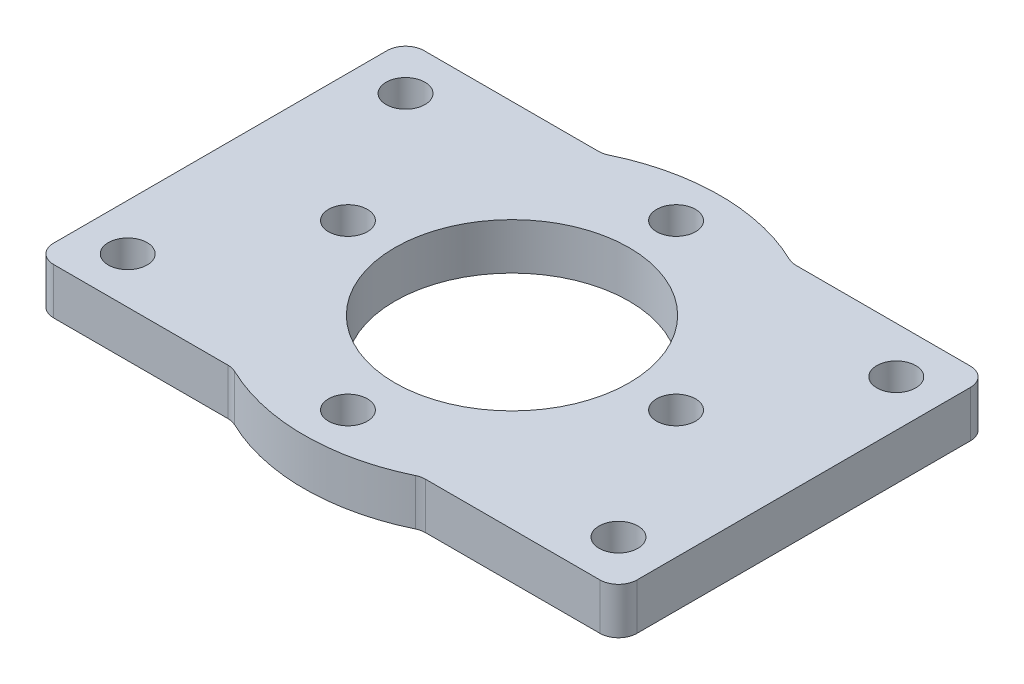
ISO-10303-21;
HEADER;
FILE_DESCRIPTION(('STEP AP214'),'2;1');
FILE_NAME('part.step','',(''),(''),'','','');
FILE_SCHEMA(('AUTOMOTIVE_DESIGN { 1 0 10303 214 1 1 1 1 }'));
ENDSEC;
DATA;
#1=APPLICATION_CONTEXT('core data for automotive mechanical design processes');
#2=APPLICATION_PROTOCOL_DEFINITION('international standard','automotive_design',2000,#1);
#3=PRODUCT_CONTEXT('',#1,'mechanical');
#4=PRODUCT('Part','Part','',(#3));
#5=PRODUCT_RELATED_PRODUCT_CATEGORY('part','',(#4));
#6=PRODUCT_DEFINITION_FORMATION('','',#4);
#7=PRODUCT_DEFINITION_CONTEXT('part definition',#1,'design');
#8=PRODUCT_DEFINITION('design','',#6,#7);
#9=PRODUCT_DEFINITION_SHAPE('','',#8);
#10=(LENGTH_UNIT() NAMED_UNIT(*) SI_UNIT(.MILLI.,.METRE.));
#11=(NAMED_UNIT(*) PLANE_ANGLE_UNIT() SI_UNIT($,.RADIAN.));
#12=(NAMED_UNIT(*) SI_UNIT($,.STERADIAN.) SOLID_ANGLE_UNIT());
#13=UNCERTAINTY_MEASURE_WITH_UNIT(LENGTH_MEASURE(1.E-05),#10,'distance_accuracy_value','');
#14=(GEOMETRIC_REPRESENTATION_CONTEXT(3) GLOBAL_UNCERTAINTY_ASSIGNED_CONTEXT((#13)) GLOBAL_UNIT_ASSIGNED_CONTEXT((#10,
#11,#12)) REPRESENTATION_CONTEXT('',''));
#15=CARTESIAN_POINT('',(0.,0.,0.));
#16=DIRECTION('',(0.,0.,1.));
#17=DIRECTION('',(1.,0.,0.));
#18=AXIS2_PLACEMENT_3D('',#15,#16,#17);
#19=CARTESIAN_POINT('',(0.,6.35,0.));
#20=DIRECTION('',(0.,-1.,0.));
#21=DIRECTION('',(0.,0.,-1.));
#22=AXIS2_PLACEMENT_3D('',#19,#20,#21);
#23=CYLINDRICAL_SURFACE('',#22,28.5);
#24=CARTESIAN_POINT('',(0.,0.,0.));
#25=DIRECTION('',(0.,1.,0.));
#26=DIRECTION('',(0.,0.,1.));
#27=AXIS2_PLACEMENT_3D('',#24,#25,#26);
#28=CIRCLE('',#27,28.5);
#29=CARTESIAN_POINT('',(12.4152759939626,0.,-25.6536726804124));
#30=VERTEX_POINT('',#29);
#31=CARTESIAN_POINT('',(-12.4152759939626,0.,-25.6536726804124));
#32=VERTEX_POINT('',#31);
#33=EDGE_CURVE('E211',#30,#32,#28,.T.);
#34=ORIENTED_EDGE('',*,*,#33,.T.);
#35=DIRECTION('',(0.,-1.,0.));
#36=VECTOR('',#35,1.);
#37=CARTESIAN_POINT('',(-12.4152759939626,6.35,-25.6536726804124));
#38=LINE('',#37,#36);
#39=CARTESIAN_POINT('',(-12.4152759939626,6.35,-25.6536726804124));
#40=VERTEX_POINT('',#39);
#41=EDGE_CURVE('E256',#32,#40,#38,.F.);
#42=ORIENTED_EDGE('',*,*,#41,.T.);
#43=CARTESIAN_POINT('',(0.,6.35,0.));
#44=DIRECTION('',(0.,1.,0.));
#45=DIRECTION('',(0.,0.,1.));
#46=AXIS2_PLACEMENT_3D('',#43,#44,#45);
#47=CIRCLE('',#46,28.5);
#48=CARTESIAN_POINT('',(12.4152759939626,6.35,-25.6536726804124));
#49=VERTEX_POINT('',#48);
#50=EDGE_CURVE('E229',#49,#40,#47,.T.);
#51=ORIENTED_EDGE('',*,*,#50,.F.);
#52=DIRECTION('',(0.,-1.,0.));
#53=VECTOR('',#52,1.);
#54=CARTESIAN_POINT('',(12.4152759939626,6.35,-25.6536726804124));
#55=LINE('',#54,#53);
#56=EDGE_CURVE('E252',#49,#30,#55,.T.);
#57=ORIENTED_EDGE('',*,*,#56,.T.);
#58=EDGE_LOOP('',(#34,#42,#51,#57));
#59=FACE_BOUND('',#58,.T.);
#60=ADVANCED_FACE('F39',(#59),#23,.T.);
#61=CARTESIAN_POINT('',(-12.9263297188336,6.35,-25.4));
#62=DIRECTION('',(0.,0.,1.));
#63=DIRECTION('',(1.,0.,0.));
#64=AXIS2_PLACEMENT_3D('',#61,#62,#63);
#65=PLANE('',#64);
#66=DIRECTION('',(-1.,0.,0.));
#67=VECTOR('',#66,1.);
#68=CARTESIAN_POINT('',(-12.9263297188336,0.,-25.4));
#69=LINE('',#68,#67);
#70=CARTESIAN_POINT('',(-13.5217602404421,0.,-25.4));
#71=VERTEX_POINT('',#70);
#72=CARTESIAN_POINT('',(-37.46,0.,-25.4));
#73=VERTEX_POINT('',#72);
#74=EDGE_CURVE('E204',#71,#73,#69,.T.);
#75=ORIENTED_EDGE('',*,*,#74,.T.);
#76=DIRECTION('',(0.,-1.,0.));
#77=VECTOR('',#76,1.);
#78=CARTESIAN_POINT('',(-37.46,6.35,-25.4));
#79=LINE('',#78,#77);
#80=CARTESIAN_POINT('',(-37.46,6.35,-25.4));
#81=VERTEX_POINT('',#80);
#82=EDGE_CURVE('E179',#73,#81,#79,.F.);
#83=ORIENTED_EDGE('',*,*,#82,.T.);
#84=DIRECTION('',(-1.,0.,0.));
#85=VECTOR('',#84,1.);
#86=CARTESIAN_POINT('',(-12.9263297188336,6.35,-25.4));
#87=LINE('',#86,#85);
#88=CARTESIAN_POINT('',(-13.5217602404421,6.35,-25.4));
#89=VERTEX_POINT('',#88);
#90=EDGE_CURVE('E361',#89,#81,#87,.T.);
#91=ORIENTED_EDGE('',*,*,#90,.F.);
#92=DIRECTION('',(0.,1.,0.));
#93=VECTOR('',#92,1.);
#94=CARTESIAN_POINT('',(-13.5217602404421,0.,-25.4));
#95=LINE('',#94,#93);
#96=EDGE_CURVE('E185',#89,#71,#95,.F.);
#97=ORIENTED_EDGE('',*,*,#96,.T.);
#98=EDGE_LOOP('',(#75,#83,#91,#97));
#99=FACE_BOUND('',#98,.T.);
#100=ADVANCED_FACE('F372',(#99),#65,.F.);
#101=CARTESIAN_POINT('',(-40.,6.35,-25.4));
#102=DIRECTION('',(1.,0.,0.));
#103=DIRECTION('',(0.,0.,-1.));
#104=AXIS2_PLACEMENT_3D('',#101,#102,#103);
#105=PLANE('',#104);
#106=DIRECTION('',(0.,0.,1.));
#107=VECTOR('',#106,1.);
#108=CARTESIAN_POINT('',(-40.,6.35,-25.4));
#109=LINE('',#108,#107);
#110=CARTESIAN_POINT('',(-40.,6.35,-22.86));
#111=VERTEX_POINT('',#110);
#112=CARTESIAN_POINT('',(-40.,6.35,22.86));
#113=VERTEX_POINT('',#112);
#114=EDGE_CURVE('E195',#111,#113,#109,.T.);
#115=ORIENTED_EDGE('',*,*,#114,.F.);
#116=DIRECTION('',(0.,-1.,0.));
#117=VECTOR('',#116,1.);
#118=CARTESIAN_POINT('',(-40.,6.35,-22.86));
#119=LINE('',#118,#117);
#120=CARTESIAN_POINT('',(-40.,0.,-22.86));
#121=VERTEX_POINT('',#120);
#122=EDGE_CURVE('E178',#111,#121,#119,.T.);
#123=ORIENTED_EDGE('',*,*,#122,.T.);
#124=DIRECTION('',(0.,0.,1.));
#125=VECTOR('',#124,1.);
#126=CARTESIAN_POINT('',(-40.,0.,-25.4));
#127=LINE('',#126,#125);
#128=CARTESIAN_POINT('',(-40.,0.,22.86));
#129=VERTEX_POINT('',#128);
#130=EDGE_CURVE('E192',#121,#129,#127,.T.);
#131=ORIENTED_EDGE('',*,*,#130,.T.);
#132=DIRECTION('',(0.,-1.,0.));
#133=VECTOR('',#132,1.);
#134=CARTESIAN_POINT('',(-40.,6.35,22.86));
#135=LINE('',#134,#133);
#136=EDGE_CURVE('E198',#129,#113,#135,.F.);
#137=ORIENTED_EDGE('',*,*,#136,.T.);
#138=EDGE_LOOP('',(#115,#123,#131,#137));
#139=FACE_BOUND('',#138,.T.);
#140=ADVANCED_FACE('F191',(#139),#105,.F.);
#141=CARTESIAN_POINT('',(-12.9263297188336,6.35,25.4));
#142=DIRECTION('',(0.,0.,-1.));
#143=DIRECTION('',(-1.,0.,0.));
#144=AXIS2_PLACEMENT_3D('',#141,#142,#143);
#145=PLANE('',#144);
#146=DIRECTION('',(1.,0.,0.));
#147=VECTOR('',#146,1.);
#148=CARTESIAN_POINT('',(-12.9263297188336,0.,25.4));
#149=LINE('',#148,#147);
#150=CARTESIAN_POINT('',(-37.46,0.,25.4));
#151=VERTEX_POINT('',#150);
#152=CARTESIAN_POINT('',(-13.5217602404421,0.,25.4));
#153=VERTEX_POINT('',#152);
#154=EDGE_CURVE('E203',#151,#153,#149,.T.);
#155=ORIENTED_EDGE('',*,*,#154,.T.);
#156=DIRECTION('',(0.,1.,0.));
#157=VECTOR('',#156,1.);
#158=CARTESIAN_POINT('',(-13.5217602404421,6.35,25.4));
#159=LINE('',#158,#157);
#160=CARTESIAN_POINT('',(-13.5217602404421,6.35,25.4));
#161=VERTEX_POINT('',#160);
#162=EDGE_CURVE('E287',#153,#161,#159,.T.);
#163=ORIENTED_EDGE('',*,*,#162,.T.);
#164=DIRECTION('',(1.,0.,0.));
#165=VECTOR('',#164,1.);
#166=CARTESIAN_POINT('',(-12.9263297188336,6.35,25.4));
#167=LINE('',#166,#165);
#168=CARTESIAN_POINT('',(-37.46,6.35,25.4));
#169=VERTEX_POINT('',#168);
#170=EDGE_CURVE('E323',#169,#161,#167,.T.);
#171=ORIENTED_EDGE('',*,*,#170,.F.);
#172=DIRECTION('',(0.,-1.,0.));
#173=VECTOR('',#172,1.);
#174=CARTESIAN_POINT('',(-37.46,6.35,25.4));
#175=LINE('',#174,#173);
#176=EDGE_CURVE('E283',#169,#151,#175,.T.);
#177=ORIENTED_EDGE('',*,*,#176,.T.);
#178=EDGE_LOOP('',(#155,#163,#171,#177));
#179=FACE_BOUND('',#178,.T.);
#180=ADVANCED_FACE('F311',(#179),#145,.F.);
#181=CARTESIAN_POINT('',(0.,6.35,0.));
#182=DIRECTION('',(0.,-1.,0.));
#183=DIRECTION('',(0.,0.,-1.));
#184=AXIS2_PLACEMENT_3D('',#181,#182,#183);
#185=CYLINDRICAL_SURFACE('',#184,28.5);
#186=CARTESIAN_POINT('',(0.,0.,0.));
#187=DIRECTION('',(0.,1.,0.));
#188=DIRECTION('',(0.,0.,1.));
#189=AXIS2_PLACEMENT_3D('',#186,#187,#188);
#190=CIRCLE('',#189,28.5);
#191=CARTESIAN_POINT('',(-12.4152759939626,0.,25.6536726804124));
#192=VERTEX_POINT('',#191);
#193=CARTESIAN_POINT('',(12.4152759939626,0.,25.6536726804124));
#194=VERTEX_POINT('',#193);
#195=EDGE_CURVE('E208',#192,#194,#190,.T.);
#196=ORIENTED_EDGE('',*,*,#195,.T.);
#197=DIRECTION('',(0.,-1.,0.));
#198=VECTOR('',#197,1.);
#199=CARTESIAN_POINT('',(12.4152759939626,6.35,25.6536726804124));
#200=LINE('',#199,#198);
#201=CARTESIAN_POINT('',(12.4152759939626,6.35,25.6536726804124));
#202=VERTEX_POINT('',#201);
#203=EDGE_CURVE('E280',#194,#202,#200,.F.);
#204=ORIENTED_EDGE('',*,*,#203,.T.);
#205=CARTESIAN_POINT('',(0.,6.35,0.));
#206=DIRECTION('',(0.,1.,0.));
#207=DIRECTION('',(0.,0.,1.));
#208=AXIS2_PLACEMENT_3D('',#205,#206,#207);
#209=CIRCLE('',#208,28.5);
#210=CARTESIAN_POINT('',(-12.4152759939626,6.35,25.6536726804124));
#211=VERTEX_POINT('',#210);
#212=EDGE_CURVE('E321',#211,#202,#209,.T.);
#213=ORIENTED_EDGE('',*,*,#212,.F.);
#214=DIRECTION('',(0.,-1.,0.));
#215=VECTOR('',#214,1.);
#216=CARTESIAN_POINT('',(-12.4152759939626,6.35,25.6536726804124));
#217=LINE('',#216,#215);
#218=EDGE_CURVE('E276',#211,#192,#217,.T.);
#219=ORIENTED_EDGE('',*,*,#218,.T.);
#220=EDGE_LOOP('',(#196,#204,#213,#219));
#221=FACE_BOUND('',#220,.T.);
#222=ADVANCED_FACE('F325',(#221),#185,.T.);
#223=CARTESIAN_POINT('',(40.,6.35,25.4));
#224=DIRECTION('',(0.,0.,-1.));
#225=DIRECTION('',(-1.,0.,0.));
#226=AXIS2_PLACEMENT_3D('',#223,#224,#225);
#227=PLANE('',#226);
#228=DIRECTION('',(1.,0.,0.));
#229=VECTOR('',#228,1.);
#230=CARTESIAN_POINT('',(40.,0.,25.4));
#231=LINE('',#230,#229);
#232=CARTESIAN_POINT('',(13.5217602404421,0.,25.4));
#233=VERTEX_POINT('',#232);
#234=CARTESIAN_POINT('',(37.46,0.,25.4));
#235=VERTEX_POINT('',#234);
#236=EDGE_CURVE('E218',#233,#235,#231,.T.);
#237=ORIENTED_EDGE('',*,*,#236,.T.);
#238=DIRECTION('',(0.,-1.,0.));
#239=VECTOR('',#238,1.);
#240=CARTESIAN_POINT('',(37.46,6.35,25.4));
#241=LINE('',#240,#239);
#242=CARTESIAN_POINT('',(37.46,6.35,25.4));
#243=VERTEX_POINT('',#242);
#244=EDGE_CURVE('E273',#235,#243,#241,.F.);
#245=ORIENTED_EDGE('',*,*,#244,.T.);
#246=DIRECTION('',(1.,0.,0.));
#247=VECTOR('',#246,1.);
#248=CARTESIAN_POINT('',(40.,6.35,25.4));
#249=LINE('',#248,#247);
#250=CARTESIAN_POINT('',(13.5217602404421,6.35,25.4));
#251=VERTEX_POINT('',#250);
#252=EDGE_CURVE('E328',#251,#243,#249,.T.);
#253=ORIENTED_EDGE('',*,*,#252,.F.);
#254=DIRECTION('',(0.,1.,0.));
#255=VECTOR('',#254,1.);
#256=CARTESIAN_POINT('',(13.5217602404421,0.,25.4));
#257=LINE('',#256,#255);
#258=EDGE_CURVE('E269',#251,#233,#257,.F.);
#259=ORIENTED_EDGE('',*,*,#258,.T.);
#260=EDGE_LOOP('',(#237,#245,#253,#259));
#261=FACE_BOUND('',#260,.T.);
#262=ADVANCED_FACE('F408',(#261),#227,.F.);
#263=CARTESIAN_POINT('',(40.,6.35,-25.4));
#264=DIRECTION('',(-1.,0.,0.));
#265=DIRECTION('',(0.,0.,1.));
#266=AXIS2_PLACEMENT_3D('',#263,#264,#265);
#267=PLANE('',#266);
#268=DIRECTION('',(0.,0.,-1.));
#269=VECTOR('',#268,1.);
#270=CARTESIAN_POINT('',(40.,0.,-25.4));
#271=LINE('',#270,#269);
#272=CARTESIAN_POINT('',(40.,0.,22.86));
#273=VERTEX_POINT('',#272);
#274=CARTESIAN_POINT('',(40.,0.,-22.86));
#275=VERTEX_POINT('',#274);
#276=EDGE_CURVE('E222',#273,#275,#271,.T.);
#277=ORIENTED_EDGE('',*,*,#276,.T.);
#278=DIRECTION('',(0.,-1.,0.));
#279=VECTOR('',#278,1.);
#280=CARTESIAN_POINT('',(40.,6.35,-22.86));
#281=LINE('',#280,#279);
#282=CARTESIAN_POINT('',(40.,6.35,-22.86));
#283=VERTEX_POINT('',#282);
#284=EDGE_CURVE('E267',#275,#283,#281,.F.);
#285=ORIENTED_EDGE('',*,*,#284,.T.);
#286=DIRECTION('',(0.,0.,-1.));
#287=VECTOR('',#286,1.);
#288=CARTESIAN_POINT('',(40.,6.35,-25.4));
#289=LINE('',#288,#287);
#290=CARTESIAN_POINT('',(40.,6.35,22.86));
#291=VERTEX_POINT('',#290);
#292=EDGE_CURVE('E333',#291,#283,#289,.T.);
#293=ORIENTED_EDGE('',*,*,#292,.F.);
#294=DIRECTION('',(0.,-1.,0.));
#295=VECTOR('',#294,1.);
#296=CARTESIAN_POINT('',(40.,6.35,22.86));
#297=LINE('',#296,#295);
#298=EDGE_CURVE('E263',#291,#273,#297,.T.);
#299=ORIENTED_EDGE('',*,*,#298,.T.);
#300=EDGE_LOOP('',(#277,#285,#293,#299));
#301=FACE_BOUND('',#300,.T.);
#302=ADVANCED_FACE('F414',(#301),#267,.F.);
#303=CARTESIAN_POINT('',(40.,6.35,-25.4));
#304=DIRECTION('',(0.,0.,1.));
#305=DIRECTION('',(1.,0.,0.));
#306=AXIS2_PLACEMENT_3D('',#303,#304,#305);
#307=PLANE('',#306);
#308=DIRECTION('',(-1.,0.,0.));
#309=VECTOR('',#308,1.);
#310=CARTESIAN_POINT('',(40.,0.,-25.4));
#311=LINE('',#310,#309);
#312=CARTESIAN_POINT('',(37.46,0.,-25.4));
#313=VERTEX_POINT('',#312);
#314=CARTESIAN_POINT('',(13.5217602404421,0.,-25.4));
#315=VERTEX_POINT('',#314);
#316=EDGE_CURVE('E226',#313,#315,#311,.T.);
#317=ORIENTED_EDGE('',*,*,#316,.T.);
#318=DIRECTION('',(0.,1.,0.));
#319=VECTOR('',#318,1.);
#320=CARTESIAN_POINT('',(13.5217602404421,6.35,-25.4));
#321=LINE('',#320,#319);
#322=CARTESIAN_POINT('',(13.5217602404421,6.35,-25.4));
#323=VERTEX_POINT('',#322);
#324=EDGE_CURVE('E55',#315,#323,#321,.T.);
#325=ORIENTED_EDGE('',*,*,#324,.T.);
#326=DIRECTION('',(-1.,0.,0.));
#327=VECTOR('',#326,1.);
#328=CARTESIAN_POINT('',(40.,6.35,-25.4));
#329=LINE('',#328,#327);
#330=CARTESIAN_POINT('',(37.46,6.35,-25.4));
#331=VERTEX_POINT('',#330);
#332=EDGE_CURVE('E231',#331,#323,#329,.T.);
#333=ORIENTED_EDGE('',*,*,#332,.F.);
#334=DIRECTION('',(0.,-1.,0.));
#335=VECTOR('',#334,1.);
#336=CARTESIAN_POINT('',(37.46,6.35,-25.4));
#337=LINE('',#336,#335);
#338=EDGE_CURVE('E258',#331,#313,#337,.T.);
#339=ORIENTED_EDGE('',*,*,#338,.T.);
#340=EDGE_LOOP('',(#317,#325,#333,#339));
#341=FACE_BOUND('',#340,.T.);
#342=ADVANCED_FACE('F419',(#341),#307,.F.);
#343=CARTESIAN_POINT('',(0.,6.35,0.));
#344=DIRECTION('',(0.,1.,0.));
#345=DIRECTION('',(0.,0.,1.));
#346=AXIS2_PLACEMENT_3D('',#343,#344,#345);
#347=PLANE('',#346);
#348=CARTESIAN_POINT('',(-33.65,6.35,19.05));
#349=DIRECTION('',(0.,1.,0.));
#350=DIRECTION('',(0.,0.,1.));
#351=AXIS2_PLACEMENT_3D('',#348,#349,#350);
#352=CIRCLE('',#351,2.665);
#353=CARTESIAN_POINT('',(-33.65,6.35,21.715));
#354=VERTEX_POINT('',#353);
#355=EDGE_CURVE('E642',#354,#354,#352,.T.);
#356=ORIENTED_EDGE('',*,*,#355,.F.);
#357=EDGE_LOOP('',(#356));
#358=FACE_BOUND('',#357,.T.);
#359=CARTESIAN_POINT('',(33.65,6.35,-19.05));
#360=DIRECTION('',(0.,1.,0.));
#361=DIRECTION('',(0.,0.,-1.));
#362=AXIS2_PLACEMENT_3D('',#359,#360,#361);
#363=CIRCLE('',#362,2.665);
#364=CARTESIAN_POINT('',(33.65,6.35,-21.715));
#365=VERTEX_POINT('',#364);
#366=EDGE_CURVE('E655',#365,#365,#363,.T.);
#367=ORIENTED_EDGE('',*,*,#366,.F.);
#368=EDGE_LOOP('',(#367));
#369=FACE_BOUND('',#368,.T.);
#370=CARTESIAN_POINT('',(33.65,6.35,19.05));
#371=DIRECTION('',(0.,1.,0.));
#372=DIRECTION('',(0.,0.,-1.));
#373=AXIS2_PLACEMENT_3D('',#370,#371,#372);
#374=CIRCLE('',#373,2.665);
#375=CARTESIAN_POINT('',(33.65,6.35,16.385));
#376=VERTEX_POINT('',#375);
#377=EDGE_CURVE('E661',#376,#376,#374,.T.);
#378=ORIENTED_EDGE('',*,*,#377,.F.);
#379=EDGE_LOOP('',(#378));
#380=FACE_BOUND('',#379,.T.);
#381=CARTESIAN_POINT('',(-33.65,6.35,-19.05));
#382=DIRECTION('',(0.,1.,0.));
#383=DIRECTION('',(0.,0.,1.));
#384=AXIS2_PLACEMENT_3D('',#381,#382,#383);
#385=CIRCLE('',#384,2.665);
#386=CARTESIAN_POINT('',(-33.65,6.35,-16.385));
#387=VERTEX_POINT('',#386);
#388=EDGE_CURVE('E647',#387,#387,#385,.T.);
#389=ORIENTED_EDGE('',*,*,#388,.F.);
#390=EDGE_LOOP('',(#389));
#391=FACE_BOUND('',#390,.T.);
#392=CARTESIAN_POINT('',(22.5000000000006,6.35,-6.36733006886009E-13));
#393=DIRECTION('',(0.,1.,0.));
#394=DIRECTION('',(0.,0.,1.));
#395=AXIS2_PLACEMENT_3D('',#392,#393,#394);
#396=CIRCLE('',#395,2.6650000000005);
#397=CARTESIAN_POINT('',(22.5000000000006,6.35,2.66499999999986));
#398=VERTEX_POINT('',#397);
#399=EDGE_CURVE('E672',#398,#398,#396,.T.);
#400=ORIENTED_EDGE('',*,*,#399,.F.);
#401=EDGE_LOOP('',(#400));
#402=FACE_BOUND('',#401,.T.);
#403=CARTESIAN_POINT('',(1.27346601377202E-12,6.35,22.5));
#404=DIRECTION('',(0.,1.,0.));
#405=DIRECTION('',(0.,0.,1.));
#406=AXIS2_PLACEMENT_3D('',#403,#404,#405);
#407=CIRCLE('',#406,2.66500000000137);
#408=CARTESIAN_POINT('',(1.27346601377202E-12,6.35,25.1650000000014));
#409=VERTEX_POINT('',#408);
#410=EDGE_CURVE('E680',#409,#409,#407,.T.);
#411=ORIENTED_EDGE('',*,*,#410,.F.);
#412=EDGE_LOOP('',(#411));
#413=FACE_BOUND('',#412,.T.);
#414=CARTESIAN_POINT('',(-22.4999999999994,6.35,6.3948846218409E-13));
#415=DIRECTION('',(0.,1.,0.));
#416=DIRECTION('',(0.,0.,1.));
#417=AXIS2_PLACEMENT_3D('',#414,#415,#416);
#418=CIRCLE('',#417,2.66500000000102);
#419=CARTESIAN_POINT('',(-22.4999999999994,6.35,2.66500000000166));
#420=VERTEX_POINT('',#419);
#421=EDGE_CURVE('E671',#420,#420,#418,.T.);
#422=ORIENTED_EDGE('',*,*,#421,.F.);
#423=EDGE_LOOP('',(#422));
#424=FACE_BOUND('',#423,.T.);
#425=CARTESIAN_POINT('',(0.,6.35,-22.5));
#426=DIRECTION('',(0.,1.,0.));
#427=DIRECTION('',(0.,0.,1.));
#428=AXIS2_PLACEMENT_3D('',#425,#426,#427);
#429=CIRCLE('',#428,2.665);
#430=CARTESIAN_POINT('',(0.,6.35,-19.835));
#431=VERTEX_POINT('',#430);
#432=EDGE_CURVE('E679',#431,#431,#429,.T.);
#433=ORIENTED_EDGE('',*,*,#432,.F.);
#434=EDGE_LOOP('',(#433));
#435=FACE_BOUND('',#434,.T.);
#436=CARTESIAN_POINT('',(0.,6.35,0.));
#437=DIRECTION('',(0.,1.,0.));
#438=DIRECTION('',(0.,0.,1.));
#439=AXIS2_PLACEMENT_3D('',#436,#437,#438);
#440=CIRCLE('',#439,16.0655);
#441=CARTESIAN_POINT('',(0.,6.35,16.0655));
#442=VERTEX_POINT('',#441);
#443=EDGE_CURVE('E349',#442,#442,#440,.T.);
#444=ORIENTED_EDGE('',*,*,#443,.F.);
#445=EDGE_LOOP('',(#444));
#446=FACE_BOUND('',#445,.T.);
#447=ORIENTED_EDGE('',*,*,#90,.T.);
#448=CARTESIAN_POINT('',(-37.46,6.35,-22.86));
#449=DIRECTION('',(0.,1.,0.));
#450=DIRECTION('',(0.,0.,1.));
#451=AXIS2_PLACEMENT_3D('',#448,#449,#450);
#452=CIRCLE('',#451,2.54);
#453=EDGE_CURVE('E250',#81,#111,#452,.T.);
#454=ORIENTED_EDGE('',*,*,#453,.T.);
#455=ORIENTED_EDGE('',*,*,#114,.T.);
#456=CARTESIAN_POINT('',(-37.46,6.35,22.86));
#457=DIRECTION('',(0.,1.,0.));
#458=DIRECTION('',(0.,0.,1.));
#459=AXIS2_PLACEMENT_3D('',#456,#457,#458);
#460=CIRCLE('',#459,2.54);
#461=EDGE_CURVE('E243',#113,#169,#460,.T.);
#462=ORIENTED_EDGE('',*,*,#461,.T.);
#463=ORIENTED_EDGE('',*,*,#170,.T.);
#464=CARTESIAN_POINT('',(-13.5217602404421,6.35,27.94));
#465=DIRECTION('',(0.,1.,0.));
#466=DIRECTION('',(0.,0.,1.));
#467=AXIS2_PLACEMENT_3D('',#464,#465,#466);
#468=CIRCLE('',#467,2.54);
#469=EDGE_CURVE('E11',#161,#211,#468,.F.);
#470=ORIENTED_EDGE('',*,*,#469,.T.);
#471=ORIENTED_EDGE('',*,*,#212,.T.);
#472=CARTESIAN_POINT('',(13.5217602404421,6.35,27.94));
#473=DIRECTION('',(0.,1.,0.));
#474=DIRECTION('',(0.,0.,1.));
#475=AXIS2_PLACEMENT_3D('',#472,#473,#474);
#476=CIRCLE('',#475,2.54);
#477=EDGE_CURVE('E302',#202,#251,#476,.F.);
#478=ORIENTED_EDGE('',*,*,#477,.T.);
#479=ORIENTED_EDGE('',*,*,#252,.T.);
#480=CARTESIAN_POINT('',(37.46,6.35,22.86));
#481=DIRECTION('',(0.,1.,0.));
#482=DIRECTION('',(0.,0.,1.));
#483=AXIS2_PLACEMENT_3D('',#480,#481,#482);
#484=CIRCLE('',#483,2.54);
#485=EDGE_CURVE('E246',#243,#291,#484,.T.);
#486=ORIENTED_EDGE('',*,*,#485,.T.);
#487=ORIENTED_EDGE('',*,*,#292,.T.);
#488=CARTESIAN_POINT('',(37.46,6.35,-22.86));
#489=DIRECTION('',(0.,1.,0.));
#490=DIRECTION('',(0.,0.,1.));
#491=AXIS2_PLACEMENT_3D('',#488,#489,#490);
#492=CIRCLE('',#491,2.54);
#493=EDGE_CURVE('E62',#283,#331,#492,.T.);
#494=ORIENTED_EDGE('',*,*,#493,.T.);
#495=ORIENTED_EDGE('',*,*,#332,.T.);
#496=CARTESIAN_POINT('',(13.5217602404421,6.35,-27.94));
#497=DIRECTION('',(0.,1.,0.));
#498=DIRECTION('',(0.,0.,1.));
#499=AXIS2_PLACEMENT_3D('',#496,#497,#498);
#500=CIRCLE('',#499,2.54);
#501=EDGE_CURVE('E297',#323,#49,#500,.F.);
#502=ORIENTED_EDGE('',*,*,#501,.T.);
#503=ORIENTED_EDGE('',*,*,#50,.T.);
#504=CARTESIAN_POINT('',(-13.5217602404421,6.35,-27.94));
#505=DIRECTION('',(0.,1.,0.));
#506=DIRECTION('',(0.,0.,1.));
#507=AXIS2_PLACEMENT_3D('',#504,#505,#506);
#508=CIRCLE('',#507,2.54);
#509=EDGE_CURVE('E292',#40,#89,#508,.F.);
#510=ORIENTED_EDGE('',*,*,#509,.T.);
#511=EDGE_LOOP('',(#447,#454,#455,#462,#463,#470,#471,#478,#479,#486,#487,#494,#495,#502,#503,#510));
#512=FACE_BOUND('',#511,.T.);
#513=ADVANCED_FACE('F320',(#358,#369,#380,#391,#402,#413,#424,#435,#446,#512),#347,.T.);
#514=CARTESIAN_POINT('',(0.,0.,0.));
#515=DIRECTION('',(0.,1.,0.));
#516=DIRECTION('',(0.,0.,1.));
#517=AXIS2_PLACEMENT_3D('',#514,#515,#516);
#518=PLANE('',#517);
#519=CARTESIAN_POINT('',(-33.65,0.,19.05));
#520=DIRECTION('',(0.,1.,0.));
#521=DIRECTION('',(0.,0.,1.));
#522=AXIS2_PLACEMENT_3D('',#519,#520,#521);
#523=CIRCLE('',#522,2.665);
#524=CARTESIAN_POINT('',(-33.65,0.,21.715));
#525=VERTEX_POINT('',#524);
#526=EDGE_CURVE('E645',#525,#525,#523,.F.);
#527=ORIENTED_EDGE('',*,*,#526,.F.);
#528=EDGE_LOOP('',(#527));
#529=FACE_BOUND('',#528,.T.);
#530=CARTESIAN_POINT('',(33.65,0.,-19.05));
#531=DIRECTION('',(0.,1.,0.));
#532=DIRECTION('',(0.,0.,1.));
#533=AXIS2_PLACEMENT_3D('',#530,#531,#532);
#534=CIRCLE('',#533,2.665);
#535=CARTESIAN_POINT('',(33.65,0.,-16.385));
#536=VERTEX_POINT('',#535);
#537=EDGE_CURVE('E652',#536,#536,#534,.F.);
#538=ORIENTED_EDGE('',*,*,#537,.F.);
#539=EDGE_LOOP('',(#538));
#540=FACE_BOUND('',#539,.T.);
#541=CARTESIAN_POINT('',(33.65,0.,19.05));
#542=DIRECTION('',(0.,1.,0.));
#543=DIRECTION('',(0.,0.,1.));
#544=AXIS2_PLACEMENT_3D('',#541,#542,#543);
#545=CIRCLE('',#544,2.665);
#546=CARTESIAN_POINT('',(33.65,0.,21.715));
#547=VERTEX_POINT('',#546);
#548=EDGE_CURVE('E658',#547,#547,#545,.F.);
#549=ORIENTED_EDGE('',*,*,#548,.F.);
#550=EDGE_LOOP('',(#549));
#551=FACE_BOUND('',#550,.T.);
#552=CARTESIAN_POINT('',(-33.65,0.,-19.05));
#553=DIRECTION('',(0.,1.,0.));
#554=DIRECTION('',(0.,0.,1.));
#555=AXIS2_PLACEMENT_3D('',#552,#553,#554);
#556=CIRCLE('',#555,2.665);
#557=CARTESIAN_POINT('',(-33.65,0.,-16.385));
#558=VERTEX_POINT('',#557);
#559=EDGE_CURVE('E650',#558,#558,#556,.F.);
#560=ORIENTED_EDGE('',*,*,#559,.F.);
#561=EDGE_LOOP('',(#560));
#562=FACE_BOUND('',#561,.T.);
#563=CARTESIAN_POINT('',(22.5000000000006,0.,-6.36733006886009E-13));
#564=DIRECTION('',(0.,1.,0.));
#565=DIRECTION('',(0.,0.,1.));
#566=AXIS2_PLACEMENT_3D('',#563,#564,#565);
#567=CIRCLE('',#566,2.6650000000005);
#568=CARTESIAN_POINT('',(22.5000000000006,0.,2.66499999999986));
#569=VERTEX_POINT('',#568);
#570=EDGE_CURVE('E675',#569,#569,#567,.F.);
#571=ORIENTED_EDGE('',*,*,#570,.F.);
#572=EDGE_LOOP('',(#571));
#573=FACE_BOUND('',#572,.T.);
#574=CARTESIAN_POINT('',(1.27346601377202E-12,0.,22.5));
#575=DIRECTION('',(0.,1.,0.));
#576=DIRECTION('',(0.,0.,1.));
#577=AXIS2_PLACEMENT_3D('',#574,#575,#576);
#578=CIRCLE('',#577,2.66500000000137);
#579=CARTESIAN_POINT('',(1.27346601377202E-12,0.,25.1650000000014));
#580=VERTEX_POINT('',#579);
#581=EDGE_CURVE('E676',#580,#580,#578,.F.);
#582=ORIENTED_EDGE('',*,*,#581,.F.);
#583=EDGE_LOOP('',(#582));
#584=FACE_BOUND('',#583,.T.);
#585=CARTESIAN_POINT('',(-22.4999999999994,0.,6.3948846218409E-13));
#586=DIRECTION('',(0.,1.,0.));
#587=DIRECTION('',(0.,0.,1.));
#588=AXIS2_PLACEMENT_3D('',#585,#586,#587);
#589=CIRCLE('',#588,2.66500000000102);
#590=CARTESIAN_POINT('',(-22.4999999999994,0.,2.66500000000166));
#591=VERTEX_POINT('',#590);
#592=EDGE_CURVE('E683',#591,#591,#589,.F.);
#593=ORIENTED_EDGE('',*,*,#592,.F.);
#594=EDGE_LOOP('',(#593));
#595=FACE_BOUND('',#594,.T.);
#596=CARTESIAN_POINT('',(0.,0.,-22.5));
#597=DIRECTION('',(0.,1.,0.));
#598=DIRECTION('',(0.,0.,1.));
#599=AXIS2_PLACEMENT_3D('',#596,#597,#598);
#600=CIRCLE('',#599,2.665);
#601=CARTESIAN_POINT('',(0.,0.,-19.835));
#602=VERTEX_POINT('',#601);
#603=EDGE_CURVE('E355',#602,#602,#600,.F.);
#604=ORIENTED_EDGE('',*,*,#603,.F.);
#605=EDGE_LOOP('',(#604));
#606=FACE_BOUND('',#605,.T.);
#607=CARTESIAN_POINT('',(0.,0.,0.));
#608=DIRECTION('',(0.,1.,0.));
#609=DIRECTION('',(0.,0.,1.));
#610=AXIS2_PLACEMENT_3D('',#607,#608,#609);
#611=CIRCLE('',#610,16.0655);
#612=CARTESIAN_POINT('',(0.,0.,16.0655));
#613=VERTEX_POINT('',#612);
#614=EDGE_CURVE('E343',#613,#613,#611,.F.);
#615=ORIENTED_EDGE('',*,*,#614,.F.);
#616=EDGE_LOOP('',(#615));
#617=FACE_BOUND('',#616,.T.);
#618=ORIENTED_EDGE('',*,*,#130,.F.);
#619=CARTESIAN_POINT('',(-37.46,0.,-22.86));
#620=DIRECTION('',(0.,1.,0.));
#621=DIRECTION('',(0.,0.,1.));
#622=AXIS2_PLACEMENT_3D('',#619,#620,#621);
#623=CIRCLE('',#622,2.54);
#624=EDGE_CURVE('E174',#121,#73,#623,.F.);
#625=ORIENTED_EDGE('',*,*,#624,.T.);
#626=ORIENTED_EDGE('',*,*,#74,.F.);
#627=CARTESIAN_POINT('',(-13.5217602404421,0.,-27.94));
#628=DIRECTION('',(0.,1.,0.));
#629=DIRECTION('',(0.,0.,1.));
#630=AXIS2_PLACEMENT_3D('',#627,#628,#629);
#631=CIRCLE('',#630,2.54);
#632=EDGE_CURVE('E290',#71,#32,#631,.T.);
#633=ORIENTED_EDGE('',*,*,#632,.T.);
#634=ORIENTED_EDGE('',*,*,#33,.F.);
#635=CARTESIAN_POINT('',(13.5217602404421,0.,-27.94));
#636=DIRECTION('',(0.,1.,0.));
#637=DIRECTION('',(0.,0.,1.));
#638=AXIS2_PLACEMENT_3D('',#635,#636,#637);
#639=CIRCLE('',#638,2.54);
#640=EDGE_CURVE('E294',#30,#315,#639,.T.);
#641=ORIENTED_EDGE('',*,*,#640,.T.);
#642=ORIENTED_EDGE('',*,*,#316,.F.);
#643=CARTESIAN_POINT('',(37.46,0.,-22.86));
#644=DIRECTION('',(0.,1.,0.));
#645=DIRECTION('',(0.,0.,1.));
#646=AXIS2_PLACEMENT_3D('',#643,#644,#645);
#647=CIRCLE('',#646,2.54);
#648=EDGE_CURVE('E186',#313,#275,#647,.F.);
#649=ORIENTED_EDGE('',*,*,#648,.T.);
#650=ORIENTED_EDGE('',*,*,#276,.F.);
#651=CARTESIAN_POINT('',(37.46,0.,22.86));
#652=DIRECTION('',(0.,1.,0.));
#653=DIRECTION('',(0.,0.,1.));
#654=AXIS2_PLACEMENT_3D('',#651,#652,#653);
#655=CIRCLE('',#654,2.54);
#656=EDGE_CURVE('E235',#273,#235,#655,.F.);
#657=ORIENTED_EDGE('',*,*,#656,.T.);
#658=ORIENTED_EDGE('',*,*,#236,.F.);
#659=CARTESIAN_POINT('',(13.5217602404421,0.,27.94));
#660=DIRECTION('',(0.,1.,0.));
#661=DIRECTION('',(0.,0.,1.));
#662=AXIS2_PLACEMENT_3D('',#659,#660,#661);
#663=CIRCLE('',#662,2.54);
#664=EDGE_CURVE('E299',#233,#194,#663,.T.);
#665=ORIENTED_EDGE('',*,*,#664,.T.);
#666=ORIENTED_EDGE('',*,*,#195,.F.);
#667=CARTESIAN_POINT('',(-13.5217602404421,0.,27.94));
#668=DIRECTION('',(0.,1.,0.));
#669=DIRECTION('',(0.,0.,1.));
#670=AXIS2_PLACEMENT_3D('',#667,#668,#669);
#671=CIRCLE('',#670,2.54);
#672=EDGE_CURVE('E48',#192,#153,#671,.T.);
#673=ORIENTED_EDGE('',*,*,#672,.T.);
#674=ORIENTED_EDGE('',*,*,#154,.F.);
#675=CARTESIAN_POINT('',(-37.46,0.,22.86));
#676=DIRECTION('',(0.,1.,0.));
#677=DIRECTION('',(0.,0.,1.));
#678=AXIS2_PLACEMENT_3D('',#675,#676,#677);
#679=CIRCLE('',#678,2.54);
#680=EDGE_CURVE('E197',#151,#129,#679,.F.);
#681=ORIENTED_EDGE('',*,*,#680,.T.);
#682=EDGE_LOOP('',(#618,#625,#626,#633,#634,#641,#642,#649,#650,#657,#658,#665,#666,#673,#674,#681));
#683=FACE_BOUND('',#682,.T.);
#684=ADVANCED_FACE('F200',(#529,#540,#551,#562,#573,#584,#595,#606,#617,#683),#518,.F.);
#685=CARTESIAN_POINT('',(0.,-0.00100000000000013,0.));
#686=DIRECTION('',(0.,1.,0.));
#687=DIRECTION('',(0.,0.,1.));
#688=AXIS2_PLACEMENT_3D('',#685,#686,#687);
#689=CYLINDRICAL_SURFACE('',#688,16.0655);
#690=ORIENTED_EDGE('',*,*,#443,.T.);
#691=EDGE_LOOP('',(#690));
#692=FACE_BOUND('',#691,.T.);
#693=ORIENTED_EDGE('',*,*,#614,.T.);
#694=EDGE_LOOP('',(#693));
#695=FACE_BOUND('',#694,.T.);
#696=ADVANCED_FACE('F484',(#692,#695),#689,.F.);
#697=CARTESIAN_POINT('',(0.,-0.00100000000000013,-22.5));
#698=DIRECTION('',(0.,1.,0.));
#699=DIRECTION('',(0.,0.,1.));
#700=AXIS2_PLACEMENT_3D('',#697,#698,#699);
#701=CYLINDRICAL_SURFACE('',#700,2.665);
#702=ORIENTED_EDGE('',*,*,#432,.T.);
#703=EDGE_LOOP('',(#702));
#704=FACE_BOUND('',#703,.T.);
#705=ORIENTED_EDGE('',*,*,#603,.T.);
#706=EDGE_LOOP('',(#705));
#707=FACE_BOUND('',#706,.T.);
#708=ADVANCED_FACE('F537',(#704,#707),#701,.F.);
#709=CARTESIAN_POINT('',(-22.4999999999994,-0.00100000000000013,6.3948846218409E-13));
#710=DIRECTION('',(0.,1.,0.));
#711=DIRECTION('',(0.,0.,1.));
#712=AXIS2_PLACEMENT_3D('',#709,#710,#711);
#713=CYLINDRICAL_SURFACE('',#712,2.66500000000102);
#714=ORIENTED_EDGE('',*,*,#421,.T.);
#715=EDGE_LOOP('',(#714));
#716=FACE_BOUND('',#715,.T.);
#717=ORIENTED_EDGE('',*,*,#592,.T.);
#718=EDGE_LOOP('',(#717));
#719=FACE_BOUND('',#718,.T.);
#720=ADVANCED_FACE('F547',(#716,#719),#713,.F.);
#721=CARTESIAN_POINT('',(1.27346601377202E-12,-0.00100000000000013,22.5));
#722=DIRECTION('',(0.,1.,0.));
#723=DIRECTION('',(0.,0.,1.));
#724=AXIS2_PLACEMENT_3D('',#721,#722,#723);
#725=CYLINDRICAL_SURFACE('',#724,2.66500000000137);
#726=ORIENTED_EDGE('',*,*,#410,.T.);
#727=EDGE_LOOP('',(#726));
#728=FACE_BOUND('',#727,.T.);
#729=ORIENTED_EDGE('',*,*,#581,.T.);
#730=EDGE_LOOP('',(#729));
#731=FACE_BOUND('',#730,.T.);
#732=ADVANCED_FACE('F555',(#728,#731),#725,.F.);
#733=CARTESIAN_POINT('',(22.5000000000006,-0.00100000000000013,-6.36733006886009E-13));
#734=DIRECTION('',(0.,1.,0.));
#735=DIRECTION('',(0.,0.,1.));
#736=AXIS2_PLACEMENT_3D('',#733,#734,#735);
#737=CYLINDRICAL_SURFACE('',#736,2.6650000000005);
#738=ORIENTED_EDGE('',*,*,#399,.T.);
#739=EDGE_LOOP('',(#738));
#740=FACE_BOUND('',#739,.T.);
#741=ORIENTED_EDGE('',*,*,#570,.T.);
#742=EDGE_LOOP('',(#741));
#743=FACE_BOUND('',#742,.T.);
#744=ADVANCED_FACE('F563',(#740,#743),#737,.F.);
#745=CARTESIAN_POINT('',(-33.65,-0.00100000000000013,-19.05));
#746=DIRECTION('',(0.,1.,0.));
#747=DIRECTION('',(0.,0.,1.));
#748=AXIS2_PLACEMENT_3D('',#745,#746,#747);
#749=CYLINDRICAL_SURFACE('',#748,2.665);
#750=ORIENTED_EDGE('',*,*,#388,.T.);
#751=EDGE_LOOP('',(#750));
#752=FACE_BOUND('',#751,.T.);
#753=ORIENTED_EDGE('',*,*,#559,.T.);
#754=EDGE_LOOP('',(#753));
#755=FACE_BOUND('',#754,.T.);
#756=ADVANCED_FACE('F571',(#752,#755),#749,.F.);
#757=CARTESIAN_POINT('',(33.65,-0.00100000000000013,19.05));
#758=DIRECTION('',(0.,1.,0.));
#759=DIRECTION('',(0.,0.,1.));
#760=AXIS2_PLACEMENT_3D('',#757,#758,#759);
#761=CYLINDRICAL_SURFACE('',#760,2.665);
#762=ORIENTED_EDGE('',*,*,#377,.T.);
#763=EDGE_LOOP('',(#762));
#764=FACE_BOUND('',#763,.T.);
#765=ORIENTED_EDGE('',*,*,#548,.T.);
#766=EDGE_LOOP('',(#765));
#767=FACE_BOUND('',#766,.T.);
#768=ADVANCED_FACE('F579',(#764,#767),#761,.F.);
#769=CARTESIAN_POINT('',(33.65,-0.00100000000000013,-19.05));
#770=DIRECTION('',(0.,1.,0.));
#771=DIRECTION('',(0.,0.,1.));
#772=AXIS2_PLACEMENT_3D('',#769,#770,#771);
#773=CYLINDRICAL_SURFACE('',#772,2.665);
#774=ORIENTED_EDGE('',*,*,#366,.T.);
#775=EDGE_LOOP('',(#774));
#776=FACE_BOUND('',#775,.T.);
#777=ORIENTED_EDGE('',*,*,#537,.T.);
#778=EDGE_LOOP('',(#777));
#779=FACE_BOUND('',#778,.T.);
#780=ADVANCED_FACE('F587',(#776,#779),#773,.F.);
#781=CARTESIAN_POINT('',(-33.65,-0.00100000000000013,19.05));
#782=DIRECTION('',(0.,1.,0.));
#783=DIRECTION('',(0.,0.,1.));
#784=AXIS2_PLACEMENT_3D('',#781,#782,#783);
#785=CYLINDRICAL_SURFACE('',#784,2.665);
#786=ORIENTED_EDGE('',*,*,#355,.T.);
#787=EDGE_LOOP('',(#786));
#788=FACE_BOUND('',#787,.T.);
#789=ORIENTED_EDGE('',*,*,#526,.T.);
#790=EDGE_LOOP('',(#789));
#791=FACE_BOUND('',#790,.T.);
#792=ADVANCED_FACE('F384',(#788,#791),#785,.F.);
#793=CARTESIAN_POINT('',(-37.46,6.35,-22.86));
#794=DIRECTION('',(0.,-1.,0.));
#795=DIRECTION('',(0.,0.,-1.));
#796=AXIS2_PLACEMENT_3D('',#793,#794,#795);
#797=CYLINDRICAL_SURFACE('',#796,2.54);
#798=ORIENTED_EDGE('',*,*,#453,.F.);
#799=ORIENTED_EDGE('',*,*,#82,.F.);
#800=ORIENTED_EDGE('',*,*,#624,.F.);
#801=ORIENTED_EDGE('',*,*,#122,.F.);
#802=EDGE_LOOP('',(#798,#799,#800,#801));
#803=FACE_BOUND('',#802,.T.);
#804=ADVANCED_FACE('F177',(#803),#797,.T.);
#805=CARTESIAN_POINT('',(-13.5217602404421,6.35,-27.94));
#806=DIRECTION('',(0.,-1.,0.));
#807=DIRECTION('',(0.,0.,-1.));
#808=AXIS2_PLACEMENT_3D('',#805,#806,#807);
#809=CYLINDRICAL_SURFACE('',#808,2.54);
#810=ORIENTED_EDGE('',*,*,#509,.F.);
#811=ORIENTED_EDGE('',*,*,#41,.F.);
#812=ORIENTED_EDGE('',*,*,#632,.F.);
#813=ORIENTED_EDGE('',*,*,#96,.F.);
#814=EDGE_LOOP('',(#810,#811,#812,#813));
#815=FACE_BOUND('',#814,.T.);
#816=ADVANCED_FACE('F383',(#815),#809,.F.);
#817=CARTESIAN_POINT('',(13.5217602404421,6.35,-27.94));
#818=DIRECTION('',(0.,-1.,0.));
#819=DIRECTION('',(0.,0.,-1.));
#820=AXIS2_PLACEMENT_3D('',#817,#818,#819);
#821=CYLINDRICAL_SURFACE('',#820,2.54);
#822=ORIENTED_EDGE('',*,*,#501,.F.);
#823=ORIENTED_EDGE('',*,*,#324,.F.);
#824=ORIENTED_EDGE('',*,*,#640,.F.);
#825=ORIENTED_EDGE('',*,*,#56,.F.);
#826=EDGE_LOOP('',(#822,#823,#824,#825));
#827=FACE_BOUND('',#826,.T.);
#828=ADVANCED_FACE('F387',(#827),#821,.F.);
#829=CARTESIAN_POINT('',(37.46,6.35,-22.86));
#830=DIRECTION('',(0.,-1.,0.));
#831=DIRECTION('',(0.,0.,-1.));
#832=AXIS2_PLACEMENT_3D('',#829,#830,#831);
#833=CYLINDRICAL_SURFACE('',#832,2.54);
#834=ORIENTED_EDGE('',*,*,#493,.F.);
#835=ORIENTED_EDGE('',*,*,#284,.F.);
#836=ORIENTED_EDGE('',*,*,#648,.F.);
#837=ORIENTED_EDGE('',*,*,#338,.F.);
#838=EDGE_LOOP('',(#834,#835,#836,#837));
#839=FACE_BOUND('',#838,.T.);
#840=ADVANCED_FACE('F391',(#839),#833,.T.);
#841=CARTESIAN_POINT('',(37.46,6.35,22.86));
#842=DIRECTION('',(0.,-1.,0.));
#843=DIRECTION('',(0.,0.,-1.));
#844=AXIS2_PLACEMENT_3D('',#841,#842,#843);
#845=CYLINDRICAL_SURFACE('',#844,2.54);
#846=ORIENTED_EDGE('',*,*,#485,.F.);
#847=ORIENTED_EDGE('',*,*,#244,.F.);
#848=ORIENTED_EDGE('',*,*,#656,.F.);
#849=ORIENTED_EDGE('',*,*,#298,.F.);
#850=EDGE_LOOP('',(#846,#847,#848,#849));
#851=FACE_BOUND('',#850,.T.);
#852=ADVANCED_FACE('F395',(#851),#845,.T.);
#853=CARTESIAN_POINT('',(13.5217602404421,6.35,27.94));
#854=DIRECTION('',(0.,-1.,0.));
#855=DIRECTION('',(0.,0.,-1.));
#856=AXIS2_PLACEMENT_3D('',#853,#854,#855);
#857=CYLINDRICAL_SURFACE('',#856,2.54);
#858=ORIENTED_EDGE('',*,*,#477,.F.);
#859=ORIENTED_EDGE('',*,*,#203,.F.);
#860=ORIENTED_EDGE('',*,*,#664,.F.);
#861=ORIENTED_EDGE('',*,*,#258,.F.);
#862=EDGE_LOOP('',(#858,#859,#860,#861));
#863=FACE_BOUND('',#862,.T.);
#864=ADVANCED_FACE('F370',(#863),#857,.F.);
#865=CARTESIAN_POINT('',(-13.5217602404421,6.35,27.94));
#866=DIRECTION('',(0.,-1.,0.));
#867=DIRECTION('',(0.,0.,-1.));
#868=AXIS2_PLACEMENT_3D('',#865,#866,#867);
#869=CYLINDRICAL_SURFACE('',#868,2.54);
#870=ORIENTED_EDGE('',*,*,#469,.F.);
#871=ORIENTED_EDGE('',*,*,#162,.F.);
#872=ORIENTED_EDGE('',*,*,#672,.F.);
#873=ORIENTED_EDGE('',*,*,#218,.F.);
#874=EDGE_LOOP('',(#870,#871,#872,#873));
#875=FACE_BOUND('',#874,.T.);
#876=ADVANCED_FACE('F316',(#875),#869,.F.);
#877=CARTESIAN_POINT('',(-37.46,6.35,22.86));
#878=DIRECTION('',(0.,-1.,0.));
#879=DIRECTION('',(0.,0.,-1.));
#880=AXIS2_PLACEMENT_3D('',#877,#878,#879);
#881=CYLINDRICAL_SURFACE('',#880,2.54);
#882=ORIENTED_EDGE('',*,*,#461,.F.);
#883=ORIENTED_EDGE('',*,*,#136,.F.);
#884=ORIENTED_EDGE('',*,*,#680,.F.);
#885=ORIENTED_EDGE('',*,*,#176,.F.);
#886=EDGE_LOOP('',(#882,#883,#884,#885));
#887=FACE_BOUND('',#886,.T.);
#888=ADVANCED_FACE('F41',(#887),#881,.T.);
#889=CLOSED_SHELL('',(#60,#100,#140,#180,#222,#262,#302,#342,#513,#684,#696,#708,#720,#732,#744,
#756,#768,#780,#792,#804,#816,#828,#840,#852,#864,#876,#888));
#890=MANIFOLD_SOLID_BREP('B2',#889);
#891=ADVANCED_BREP_SHAPE_REPRESENTATION('',(#18,#890),#14);
#892=SHAPE_DEFINITION_REPRESENTATION(#9,#891);
ENDSEC;
END-ISO-10303-21;
